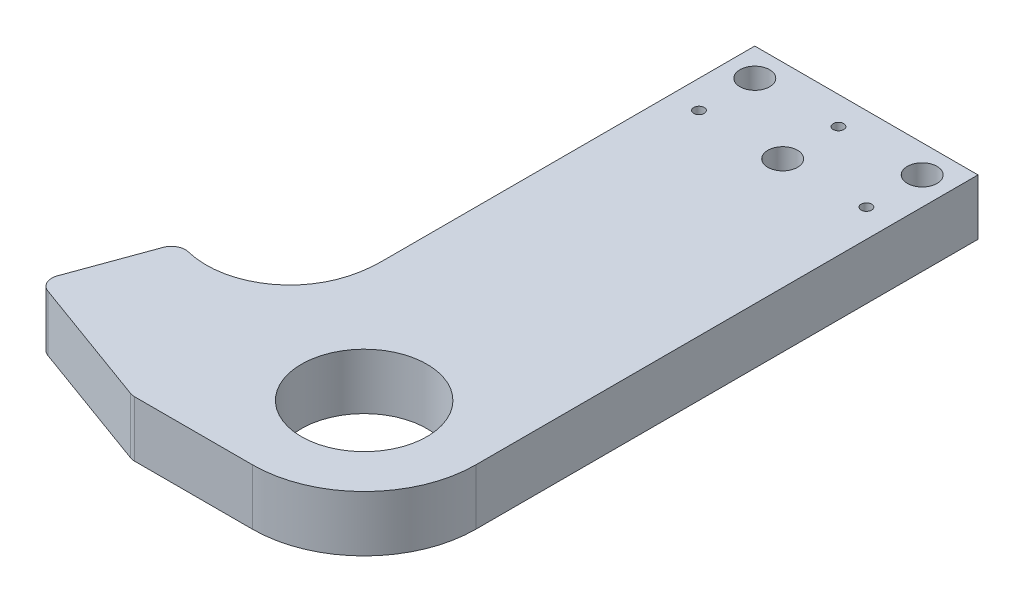
ISO-10303-21;
HEADER;
FILE_DESCRIPTION(('STEP AP214'),'2;1');
FILE_NAME('part.step','',(''),(''),'','','');
FILE_SCHEMA(('AUTOMOTIVE_DESIGN { 1 0 10303 214 1 1 1 1 }'));
ENDSEC;
DATA;
#1=APPLICATION_CONTEXT('core data for automotive mechanical design processes');
#2=APPLICATION_PROTOCOL_DEFINITION('international standard','automotive_design',2000,#1);
#3=PRODUCT_CONTEXT('',#1,'mechanical');
#4=PRODUCT('Part','Part','',(#3));
#5=PRODUCT_RELATED_PRODUCT_CATEGORY('part','',(#4));
#6=PRODUCT_DEFINITION_FORMATION('','',#4);
#7=PRODUCT_DEFINITION_CONTEXT('part definition',#1,'design');
#8=PRODUCT_DEFINITION('design','',#6,#7);
#9=PRODUCT_DEFINITION_SHAPE('','',#8);
#10=(LENGTH_UNIT() NAMED_UNIT(*) SI_UNIT(.MILLI.,.METRE.));
#11=(NAMED_UNIT(*) PLANE_ANGLE_UNIT() SI_UNIT($,.RADIAN.));
#12=(NAMED_UNIT(*) SI_UNIT($,.STERADIAN.) SOLID_ANGLE_UNIT());
#13=UNCERTAINTY_MEASURE_WITH_UNIT(LENGTH_MEASURE(1.E-05),#10,'distance_accuracy_value','');
#14=(GEOMETRIC_REPRESENTATION_CONTEXT(3) GLOBAL_UNCERTAINTY_ASSIGNED_CONTEXT((#13)) GLOBAL_UNIT_ASSIGNED_CONTEXT((#10,
#11,#12)) REPRESENTATION_CONTEXT('',''));
#15=CARTESIAN_POINT('',(0.,0.,0.));
#16=DIRECTION('',(0.,0.,1.));
#17=DIRECTION('',(1.,0.,0.));
#18=AXIS2_PLACEMENT_3D('',#15,#16,#17);
#19=CARTESIAN_POINT('',(25.4,6.35,0.));
#20=DIRECTION('',(1.,0.,0.));
#21=DIRECTION('',(0.,0.,-1.));
#22=AXIS2_PLACEMENT_3D('',#19,#20,#21);
#23=PLANE('',#22);
#24=DIRECTION('',(0.,0.,1.));
#25=VECTOR('',#24,1.);
#26=CARTESIAN_POINT('',(25.4,6.35,0.));
#27=LINE('',#26,#25);
#28=CARTESIAN_POINT('',(25.3999999999998,6.35,-57.15));
#29=VERTEX_POINT('',#28);
#30=CARTESIAN_POINT('',(25.4,6.35,57.15));
#31=VERTEX_POINT('',#30);
#32=EDGE_CURVE('E245',#29,#31,#27,.T.);
#33=ORIENTED_EDGE('',*,*,#32,.T.);
#34=DIRECTION('',(0.,-1.,0.));
#35=VECTOR('',#34,1.);
#36=CARTESIAN_POINT('',(25.4,6.35,57.15));
#37=LINE('',#36,#35);
#38=CARTESIAN_POINT('',(25.4,-6.35,57.15));
#39=VERTEX_POINT('',#38);
#40=EDGE_CURVE('E274',#31,#39,#37,.T.);
#41=ORIENTED_EDGE('',*,*,#40,.T.);
#42=DIRECTION('',(0.,0.,1.));
#43=VECTOR('',#42,1.);
#44=CARTESIAN_POINT('',(25.4,-6.35,0.));
#45=LINE('',#44,#43);
#46=CARTESIAN_POINT('',(25.3999999999998,-6.35,-57.15));
#47=VERTEX_POINT('',#46);
#48=EDGE_CURVE('E258',#47,#39,#45,.T.);
#49=ORIENTED_EDGE('',*,*,#48,.F.);
#50=DIRECTION('',(0.,-1.,0.));
#51=VECTOR('',#50,1.);
#52=CARTESIAN_POINT('',(25.3999999999998,6.35,-57.15));
#53=LINE('',#52,#51);
#54=EDGE_CURVE('E271',#29,#47,#53,.T.);
#55=ORIENTED_EDGE('',*,*,#54,.F.);
#56=EDGE_LOOP('',(#33,#41,#49,#55));
#57=FACE_BOUND('',#56,.T.);
#58=ADVANCED_FACE('F45',(#57),#23,.T.);
#59=CARTESIAN_POINT('',(0.,6.35,-57.15));
#60=DIRECTION('',(0.,0.,-1.));
#61=DIRECTION('',(-1.,0.,0.));
#62=AXIS2_PLACEMENT_3D('',#59,#60,#61);
#63=PLANE('',#62);
#64=DIRECTION('',(1.,0.,0.));
#65=VECTOR('',#64,1.);
#66=CARTESIAN_POINT('',(0.,-6.35,-57.15));
#67=LINE('',#66,#65);
#68=CARTESIAN_POINT('',(-25.4000000000002,-6.35,-57.15));
#69=VERTEX_POINT('',#68);
#70=EDGE_CURVE('E262',#69,#47,#67,.T.);
#71=ORIENTED_EDGE('',*,*,#70,.F.);
#72=DIRECTION('',(0.,-1.,0.));
#73=VECTOR('',#72,1.);
#74=CARTESIAN_POINT('',(-25.4000000000002,6.35,-57.15));
#75=LINE('',#74,#73);
#76=CARTESIAN_POINT('',(-25.4000000000002,6.35,-57.15));
#77=VERTEX_POINT('',#76);
#78=EDGE_CURVE('E257',#77,#69,#75,.T.);
#79=ORIENTED_EDGE('',*,*,#78,.F.);
#80=DIRECTION('',(1.,0.,0.));
#81=VECTOR('',#80,1.);
#82=CARTESIAN_POINT('',(0.,6.35,-57.15));
#83=LINE('',#82,#81);
#84=EDGE_CURVE('E249',#77,#29,#83,.T.);
#85=ORIENTED_EDGE('',*,*,#84,.T.);
#86=ORIENTED_EDGE('',*,*,#54,.T.);
#87=EDGE_LOOP('',(#71,#79,#85,#86));
#88=FACE_BOUND('',#87,.T.);
#89=ADVANCED_FACE('F371',(#88),#63,.T.);
#90=CARTESIAN_POINT('',(-25.4,6.35,0.));
#91=DIRECTION('',(-1.,0.,0.));
#92=DIRECTION('',(0.,0.,1.));
#93=AXIS2_PLACEMENT_3D('',#90,#91,#92);
#94=PLANE('',#93);
#95=DIRECTION('',(0.,0.,-1.));
#96=VECTOR('',#95,1.);
#97=CARTESIAN_POINT('',(-25.4,-6.35,0.));
#98=LINE('',#97,#96);
#99=CARTESIAN_POINT('',(-25.3999999999999,-6.35,27.8223380070355));
#100=VERTEX_POINT('',#99);
#101=EDGE_CURVE('E250',#100,#69,#98,.T.);
#102=ORIENTED_EDGE('',*,*,#101,.F.);
#103=DIRECTION('',(0.,-1.,0.));
#104=VECTOR('',#103,1.);
#105=CARTESIAN_POINT('',(-25.3999999999999,6.35,27.8223380070355));
#106=LINE('',#105,#104);
#107=CARTESIAN_POINT('',(-25.3999999999999,6.35,27.8223380070355));
#108=VERTEX_POINT('',#107);
#109=EDGE_CURVE('E284',#100,#108,#106,.F.);
#110=ORIENTED_EDGE('',*,*,#109,.T.);
#111=DIRECTION('',(0.,0.,-1.));
#112=VECTOR('',#111,1.);
#113=CARTESIAN_POINT('',(-25.4,6.35,0.));
#114=LINE('',#113,#112);
#115=EDGE_CURVE('E254',#108,#77,#114,.T.);
#116=ORIENTED_EDGE('',*,*,#115,.T.);
#117=ORIENTED_EDGE('',*,*,#78,.T.);
#118=EDGE_LOOP('',(#102,#110,#116,#117));
#119=FACE_BOUND('',#118,.T.);
#120=ADVANCED_FACE('F388',(#119),#94,.T.);
#121=CARTESIAN_POINT('',(0.,6.35,0.));
#122=DIRECTION('',(0.,1.,0.));
#123=DIRECTION('',(0.,0.,1.));
#124=AXIS2_PLACEMENT_3D('',#121,#122,#123);
#125=PLANE('',#124);
#126=CARTESIAN_POINT('',(19.0500000000001,6.35,-38.1));
#127=DIRECTION('',(0.,1.,0.));
#128=DIRECTION('',(0.,0.,1.));
#129=AXIS2_PLACEMENT_3D('',#126,#127,#128);
#130=CIRCLE('',#129,1.19062499999999);
#131=CARTESIAN_POINT('',(19.0500000000001,6.35,-36.909375));
#132=VERTEX_POINT('',#131);
#133=EDGE_CURVE('E159',#132,#132,#130,.T.);
#134=ORIENTED_EDGE('',*,*,#133,.F.);
#135=EDGE_LOOP('',(#134));
#136=FACE_BOUND('',#135,.T.);
#137=CARTESIAN_POINT('',(-19.0500000000001,6.35,-38.1));
#138=DIRECTION('',(0.,1.,0.));
#139=DIRECTION('',(0.,0.,1.));
#140=AXIS2_PLACEMENT_3D('',#137,#138,#139);
#141=CIRCLE('',#140,1.19062499999999);
#142=CARTESIAN_POINT('',(-19.0500000000001,6.35,-36.909375));
#143=VERTEX_POINT('',#142);
#144=EDGE_CURVE('E158',#143,#143,#141,.T.);
#145=ORIENTED_EDGE('',*,*,#144,.F.);
#146=EDGE_LOOP('',(#145));
#147=FACE_BOUND('',#146,.T.);
#148=CARTESIAN_POINT('',(-1.07552855510562E-13,6.35,-50.8));
#149=DIRECTION('',(0.,1.,0.));
#150=DIRECTION('',(0.,0.,1.));
#151=AXIS2_PLACEMENT_3D('',#148,#149,#150);
#152=CIRCLE('',#151,1.19062499999999);
#153=CARTESIAN_POINT('',(-1.07552855510562E-13,6.35,-49.609375));
#154=VERTEX_POINT('',#153);
#155=EDGE_CURVE('E173',#154,#154,#152,.T.);
#156=ORIENTED_EDGE('',*,*,#155,.F.);
#157=EDGE_LOOP('',(#156));
#158=FACE_BOUND('',#157,.T.);
#159=DIRECTION('',(0.939692620785909,0.,0.342020143325666));
#160=VECTOR('',#159,1.);
#161=CARTESIAN_POINT('',(-60.5515632410018,6.35,70.4919160399159));
#162=LINE('',#161,#160);
#163=CARTESIAN_POINT('',(-57.5680391700065,6.35,71.5778299949749));
#164=VERTEX_POINT('',#163);
#165=CARTESIAN_POINT('',(-27.9483256300921,6.35,82.3585240709952));
#166=VERTEX_POINT('',#165);
#167=EDGE_CURVE('E204',#164,#166,#162,.T.);
#168=ORIENTED_EDGE('',*,*,#167,.T.);
#169=CARTESIAN_POINT('',(-26.8624116750331,6.35,79.375));
#170=DIRECTION('',(0.,1.,0.));
#171=DIRECTION('',(0.,0.,1.));
#172=AXIS2_PLACEMENT_3D('',#169,#170,#171);
#173=CIRCLE('',#172,3.175);
#174=CARTESIAN_POINT('',(-26.8624116750331,6.35,82.55));
#175=VERTEX_POINT('',#174);
#176=EDGE_CURVE('E329',#166,#175,#173,.T.);
#177=ORIENTED_EDGE('',*,*,#176,.T.);
#178=DIRECTION('',(-1.,0.,0.));
#179=VECTOR('',#178,1.);
#180=CARTESIAN_POINT('',(-27.4222498387822,6.35,82.55));
#181=LINE('',#180,#179);
#182=CARTESIAN_POINT('',(0.,6.35,82.55));
#183=VERTEX_POINT('',#182);
#184=EDGE_CURVE('E185',#183,#175,#181,.T.);
#185=ORIENTED_EDGE('',*,*,#184,.F.);
#186=CARTESIAN_POINT('',(0.,6.35,57.15));
#187=DIRECTION('',(0.,1.,0.));
#188=DIRECTION('',(0.,0.,1.));
#189=AXIS2_PLACEMENT_3D('',#186,#187,#188);
#190=CIRCLE('',#189,25.4);
#191=EDGE_CURVE('E281',#183,#31,#190,.T.);
#192=ORIENTED_EDGE('',*,*,#191,.T.);
#193=ORIENTED_EDGE('',*,*,#32,.F.);
#194=ORIENTED_EDGE('',*,*,#84,.F.);
#195=ORIENTED_EDGE('',*,*,#115,.F.);
#196=CARTESIAN_POINT('',(-50.3999999999999,6.35,27.8223380070356));
#197=DIRECTION('',(0.,1.,0.));
#198=DIRECTION('',(0.,0.,1.));
#199=AXIS2_PLACEMENT_3D('',#196,#197,#198);
#200=CIRCLE('',#199,25.);
#201=CARTESIAN_POINT('',(-26.2925959594584,6.35,34.4429928406666));
#202=VERTEX_POINT('',#201);
#203=EDGE_CURVE('E293',#108,#202,#200,.F.);
#204=ORIENTED_EDGE('',*,*,#203,.T.);
#205=CARTESIAN_POINT('',(-44.662437838351,6.35,29.3980538574398));
#206=DIRECTION('',(0.,1.,0.));
#207=DIRECTION('',(0.,0.,1.));
#208=AXIS2_PLACEMENT_3D('',#205,#206,#207);
#209=CIRCLE('',#208,19.05);
#210=CARTESIAN_POINT('',(-49.2912086541131,6.35,47.8771496344292));
#211=VERTEX_POINT('',#210);
#212=EDGE_CURVE('E303',#202,#211,#209,.F.);
#213=ORIENTED_EDGE('',*,*,#212,.T.);
#214=CARTESIAN_POINT('',(-50.0626704567401,6.35,50.9569989305941));
#215=DIRECTION('',(0.,1.,0.));
#216=DIRECTION('',(0.,0.,1.));
#217=AXIS2_PLACEMENT_3D('',#214,#215,#216);
#218=CIRCLE('',#217,3.175);
#219=CARTESIAN_POINT('',(-53.0461945277354,6.35,49.8710849755352));
#220=VERTEX_POINT('',#219);
#221=EDGE_CURVE('E61',#211,#220,#218,.T.);
#222=ORIENTED_EDGE('',*,*,#221,.T.);
#223=DIRECTION('',(0.342020143325666,0.,-0.939692620785909));
#224=VECTOR('',#223,1.);
#225=CARTESIAN_POINT('',(-60.5515632410018,6.35,70.4919160399159));
#226=LINE('',#225,#224);
#227=CARTESIAN_POINT('',(-59.4656492859428,6.35,67.5083919689206));
#228=VERTEX_POINT('',#227);
#229=EDGE_CURVE('E201',#228,#220,#226,.T.);
#230=ORIENTED_EDGE('',*,*,#229,.F.);
#231=CARTESIAN_POINT('',(-56.4821252149475,6.35,68.5943059239796));
#232=DIRECTION('',(0.,1.,0.));
#233=DIRECTION('',(0.,0.,1.));
#234=AXIS2_PLACEMENT_3D('',#231,#232,#233);
#235=CIRCLE('',#234,3.175);
#236=EDGE_CURVE('E69',#228,#164,#235,.T.);
#237=ORIENTED_EDGE('',*,*,#236,.T.);
#238=EDGE_LOOP('',(#168,#177,#185,#192,#193,#194,#195,#204,#213,#222,#230,#237));
#239=FACE_BOUND('',#238,.T.);
#240=CARTESIAN_POINT('',(-19.0500000000001,6.35,-50.8));
#241=DIRECTION('',(0.,1.,0.));
#242=DIRECTION('',(0.,0.,1.));
#243=AXIS2_PLACEMENT_3D('',#240,#241,#242);
#244=CIRCLE('',#243,3.3782);
#245=CARTESIAN_POINT('',(-19.0500000000001,6.35,-47.4218));
#246=VERTEX_POINT('',#245);
#247=EDGE_CURVE('E212',#246,#246,#244,.T.);
#248=ORIENTED_EDGE('',*,*,#247,.F.);
#249=EDGE_LOOP('',(#248));
#250=FACE_BOUND('',#249,.T.);
#251=CARTESIAN_POINT('',(19.0499999999999,6.35,-50.8));
#252=DIRECTION('',(0.,1.,0.));
#253=DIRECTION('',(0.,0.,1.));
#254=AXIS2_PLACEMENT_3D('',#251,#252,#253);
#255=CIRCLE('',#254,3.3782);
#256=CARTESIAN_POINT('',(19.0499999999999,6.35,-47.4218));
#257=VERTEX_POINT('',#256);
#258=EDGE_CURVE('E220',#257,#257,#255,.T.);
#259=ORIENTED_EDGE('',*,*,#258,.F.);
#260=EDGE_LOOP('',(#259));
#261=FACE_BOUND('',#260,.T.);
#262=CARTESIAN_POINT('',(0.,6.35,-38.1));
#263=DIRECTION('',(0.,1.,0.));
#264=DIRECTION('',(0.,0.,1.));
#265=AXIS2_PLACEMENT_3D('',#262,#263,#264);
#266=CIRCLE('',#265,3.3782);
#267=CARTESIAN_POINT('',(0.,6.35,-34.7218));
#268=VERTEX_POINT('',#267);
#269=EDGE_CURVE('E228',#268,#268,#266,.T.);
#270=ORIENTED_EDGE('',*,*,#269,.F.);
#271=EDGE_LOOP('',(#270));
#272=FACE_BOUND('',#271,.T.);
#273=CARTESIAN_POINT('',(0.,6.35,57.15));
#274=DIRECTION('',(0.,1.,0.));
#275=DIRECTION('',(0.,0.,1.));
#276=AXIS2_PLACEMENT_3D('',#273,#274,#275);
#277=CIRCLE('',#276,14.2875);
#278=CARTESIAN_POINT('',(0.,6.35,71.4375));
#279=VERTEX_POINT('',#278);
#280=EDGE_CURVE('E236',#279,#279,#277,.T.);
#281=ORIENTED_EDGE('',*,*,#280,.F.);
#282=EDGE_LOOP('',(#281));
#283=FACE_BOUND('',#282,.T.);
#284=ADVANCED_FACE('F342',(#136,#147,#158,#239,#250,#261,#272,#283),#125,.T.);
#285=CARTESIAN_POINT('',(0.,-6.35,0.));
#286=DIRECTION('',(0.,1.,0.));
#287=DIRECTION('',(0.,0.,1.));
#288=AXIS2_PLACEMENT_3D('',#285,#286,#287);
#289=PLANE('',#288);
#290=DIRECTION('',(-1.,0.,0.));
#291=VECTOR('',#290,1.);
#292=CARTESIAN_POINT('',(-27.4222498387822,-6.35,82.55));
#293=LINE('',#292,#291);
#294=CARTESIAN_POINT('',(0.,-6.35,82.55));
#295=VERTEX_POINT('',#294);
#296=CARTESIAN_POINT('',(-26.8624116750331,-6.35,82.55));
#297=VERTEX_POINT('',#296);
#298=EDGE_CURVE('E181',#295,#297,#293,.T.);
#299=ORIENTED_EDGE('',*,*,#298,.T.);
#300=CARTESIAN_POINT('',(-26.8624116750331,-6.35,79.375));
#301=DIRECTION('',(0.,1.,0.));
#302=DIRECTION('',(0.,0.,1.));
#303=AXIS2_PLACEMENT_3D('',#300,#301,#302);
#304=CIRCLE('',#303,3.175);
#305=CARTESIAN_POINT('',(-27.9483256300921,-6.35,82.3585240709952));
#306=VERTEX_POINT('',#305);
#307=EDGE_CURVE('E316',#297,#306,#304,.F.);
#308=ORIENTED_EDGE('',*,*,#307,.T.);
#309=DIRECTION('',(0.939692620785909,0.,0.342020143325666));
#310=VECTOR('',#309,1.);
#311=CARTESIAN_POINT('',(-60.5515632410018,-6.35,70.4919160399159));
#312=LINE('',#311,#310);
#313=CARTESIAN_POINT('',(-57.5680391700065,-6.35,71.5778299949749));
#314=VERTEX_POINT('',#313);
#315=EDGE_CURVE('E208',#314,#306,#312,.T.);
#316=ORIENTED_EDGE('',*,*,#315,.F.);
#317=CARTESIAN_POINT('',(-56.4821252149475,-6.35,68.5943059239796));
#318=DIRECTION('',(0.,1.,0.));
#319=DIRECTION('',(0.,0.,1.));
#320=AXIS2_PLACEMENT_3D('',#317,#318,#319);
#321=CIRCLE('',#320,3.175);
#322=CARTESIAN_POINT('',(-59.4656492859428,-6.35,67.5083919689206));
#323=VERTEX_POINT('',#322);
#324=EDGE_CURVE('E313',#314,#323,#321,.F.);
#325=ORIENTED_EDGE('',*,*,#324,.T.);
#326=DIRECTION('',(-0.342020143325666,0.,0.939692620785909));
#327=VECTOR('',#326,1.);
#328=CARTESIAN_POINT('',(-52.0010596578601,-6.35,46.9996005202681));
#329=LINE('',#328,#327);
#330=CARTESIAN_POINT('',(-53.0461945277354,-6.35,49.8710849755351));
#331=VERTEX_POINT('',#330);
#332=EDGE_CURVE('E197',#331,#323,#329,.T.);
#333=ORIENTED_EDGE('',*,*,#332,.F.);
#334=CARTESIAN_POINT('',(-50.0626704567401,-6.34999999999999,50.9569989305941));
#335=DIRECTION('',(0.,1.,0.));
#336=DIRECTION('',(0.,0.,1.));
#337=AXIS2_PLACEMENT_3D('',#334,#335,#336);
#338=CIRCLE('',#337,3.175);
#339=CARTESIAN_POINT('',(-49.2912086541131,-6.34999999999999,47.8771496344292));
#340=VERTEX_POINT('',#339);
#341=EDGE_CURVE('E310',#331,#340,#338,.F.);
#342=ORIENTED_EDGE('',*,*,#341,.T.);
#343=CARTESIAN_POINT('',(-44.662437838351,-6.34999999999999,29.3980538574398));
#344=DIRECTION('',(0.,1.,0.));
#345=DIRECTION('',(0.,0.,1.));
#346=AXIS2_PLACEMENT_3D('',#343,#344,#345);
#347=CIRCLE('',#346,19.05);
#348=CARTESIAN_POINT('',(-26.2925959594584,-6.34999999999999,34.4429928406666));
#349=VERTEX_POINT('',#348);
#350=EDGE_CURVE('E300',#340,#349,#347,.T.);
#351=ORIENTED_EDGE('',*,*,#350,.T.);
#352=CARTESIAN_POINT('',(-50.3999999999999,-6.34999999999999,27.8223380070356));
#353=DIRECTION('',(0.,1.,0.));
#354=DIRECTION('',(0.,0.,1.));
#355=AXIS2_PLACEMENT_3D('',#352,#353,#354);
#356=CIRCLE('',#355,25.);
#357=EDGE_CURVE('E290',#349,#100,#356,.T.);
#358=ORIENTED_EDGE('',*,*,#357,.T.);
#359=ORIENTED_EDGE('',*,*,#101,.T.);
#360=ORIENTED_EDGE('',*,*,#70,.T.);
#361=ORIENTED_EDGE('',*,*,#48,.T.);
#362=CARTESIAN_POINT('',(0.,-6.35,57.15));
#363=DIRECTION('',(0.,1.,0.));
#364=DIRECTION('',(0.,0.,1.));
#365=AXIS2_PLACEMENT_3D('',#362,#363,#364);
#366=CIRCLE('',#365,25.4);
#367=EDGE_CURVE('E278',#39,#295,#366,.F.);
#368=ORIENTED_EDGE('',*,*,#367,.T.);
#369=EDGE_LOOP('',(#299,#308,#316,#325,#333,#342,#351,#358,#359,#360,#361,#368));
#370=FACE_BOUND('',#369,.T.);
#371=CARTESIAN_POINT('',(-19.0500000000001,-6.35,-50.8));
#372=DIRECTION('',(0.,1.,0.));
#373=DIRECTION('',(0.,0.,1.));
#374=AXIS2_PLACEMENT_3D('',#371,#372,#373);
#375=CIRCLE('',#374,3.3782);
#376=CARTESIAN_POINT('',(-19.0500000000001,-6.35,-47.4218));
#377=VERTEX_POINT('',#376);
#378=EDGE_CURVE('E216',#377,#377,#375,.T.);
#379=ORIENTED_EDGE('',*,*,#378,.T.);
#380=EDGE_LOOP('',(#379));
#381=FACE_BOUND('',#380,.T.);
#382=CARTESIAN_POINT('',(19.0499999999999,-6.35,-50.8));
#383=DIRECTION('',(0.,1.,0.));
#384=DIRECTION('',(0.,0.,1.));
#385=AXIS2_PLACEMENT_3D('',#382,#383,#384);
#386=CIRCLE('',#385,3.3782);
#387=CARTESIAN_POINT('',(19.0499999999999,-6.35,-47.4218));
#388=VERTEX_POINT('',#387);
#389=EDGE_CURVE('E224',#388,#388,#386,.T.);
#390=ORIENTED_EDGE('',*,*,#389,.T.);
#391=EDGE_LOOP('',(#390));
#392=FACE_BOUND('',#391,.T.);
#393=CARTESIAN_POINT('',(0.,-6.35,-38.1));
#394=DIRECTION('',(0.,1.,0.));
#395=DIRECTION('',(0.,0.,1.));
#396=AXIS2_PLACEMENT_3D('',#393,#394,#395);
#397=CIRCLE('',#396,3.3782);
#398=CARTESIAN_POINT('',(0.,-6.35,-34.7218));
#399=VERTEX_POINT('',#398);
#400=EDGE_CURVE('E232',#399,#399,#397,.T.);
#401=ORIENTED_EDGE('',*,*,#400,.T.);
#402=EDGE_LOOP('',(#401));
#403=FACE_BOUND('',#402,.T.);
#404=CARTESIAN_POINT('',(0.,-6.35,57.15));
#405=DIRECTION('',(0.,1.,0.));
#406=DIRECTION('',(0.,0.,1.));
#407=AXIS2_PLACEMENT_3D('',#404,#405,#406);
#408=CIRCLE('',#407,14.2875);
#409=CARTESIAN_POINT('',(0.,-6.35,71.4375));
#410=VERTEX_POINT('',#409);
#411=EDGE_CURVE('E237',#410,#410,#408,.T.);
#412=ORIENTED_EDGE('',*,*,#411,.T.);
#413=EDGE_LOOP('',(#412));
#414=FACE_BOUND('',#413,.T.);
#415=ADVANCED_FACE('F352',(#370,#381,#392,#403,#414),#289,.F.);
#416=CARTESIAN_POINT('',(0.,6.35,57.15));
#417=DIRECTION('',(0.,-1.,0.));
#418=DIRECTION('',(0.,0.,-1.));
#419=AXIS2_PLACEMENT_3D('',#416,#417,#418);
#420=CYLINDRICAL_SURFACE('',#419,25.4);
#421=ORIENTED_EDGE('',*,*,#191,.F.);
#422=DIRECTION('',(0.,-1.,0.));
#423=VECTOR('',#422,1.);
#424=CARTESIAN_POINT('',(0.,6.35,82.55));
#425=LINE('',#424,#423);
#426=EDGE_CURVE('E241',#183,#295,#425,.T.);
#427=ORIENTED_EDGE('',*,*,#426,.T.);
#428=ORIENTED_EDGE('',*,*,#367,.F.);
#429=ORIENTED_EDGE('',*,*,#40,.F.);
#430=EDGE_LOOP('',(#421,#427,#428,#429));
#431=FACE_BOUND('',#430,.T.);
#432=ADVANCED_FACE('F363',(#431),#420,.T.);
#433=CARTESIAN_POINT('',(0.,-6.35,57.15));
#434=DIRECTION('',(0.,1.,0.));
#435=DIRECTION('',(0.,0.,1.));
#436=AXIS2_PLACEMENT_3D('',#433,#434,#435);
#437=CYLINDRICAL_SURFACE('',#436,14.2875);
#438=ORIENTED_EDGE('',*,*,#411,.F.);
#439=EDGE_LOOP('',(#438));
#440=FACE_BOUND('',#439,.T.);
#441=ORIENTED_EDGE('',*,*,#280,.T.);
#442=EDGE_LOOP('',(#441));
#443=FACE_BOUND('',#442,.T.);
#444=ADVANCED_FACE('F406',(#440,#443),#437,.F.);
#445=CARTESIAN_POINT('',(0.,6.35,-38.1));
#446=DIRECTION('',(0.,1.,0.));
#447=DIRECTION('',(0.,0.,1.));
#448=AXIS2_PLACEMENT_3D('',#445,#446,#447);
#449=CYLINDRICAL_SURFACE('',#448,3.3782);
#450=ORIENTED_EDGE('',*,*,#400,.F.);
#451=EDGE_LOOP('',(#450));
#452=FACE_BOUND('',#451,.T.);
#453=ORIENTED_EDGE('',*,*,#269,.T.);
#454=EDGE_LOOP('',(#453));
#455=FACE_BOUND('',#454,.T.);
#456=ADVANCED_FACE('F454',(#452,#455),#449,.F.);
#457=CARTESIAN_POINT('',(19.0499999999999,6.35,-50.8));
#458=DIRECTION('',(0.,1.,0.));
#459=DIRECTION('',(0.,0.,1.));
#460=AXIS2_PLACEMENT_3D('',#457,#458,#459);
#461=CYLINDRICAL_SURFACE('',#460,3.3782);
#462=ORIENTED_EDGE('',*,*,#389,.F.);
#463=EDGE_LOOP('',(#462));
#464=FACE_BOUND('',#463,.T.);
#465=ORIENTED_EDGE('',*,*,#258,.T.);
#466=EDGE_LOOP('',(#465));
#467=FACE_BOUND('',#466,.T.);
#468=ADVANCED_FACE('F450',(#464,#467),#461,.F.);
#469=CARTESIAN_POINT('',(-19.0500000000001,6.35,-50.8));
#470=DIRECTION('',(0.,1.,0.));
#471=DIRECTION('',(0.,0.,1.));
#472=AXIS2_PLACEMENT_3D('',#469,#470,#471);
#473=CYLINDRICAL_SURFACE('',#472,3.3782);
#474=ORIENTED_EDGE('',*,*,#378,.F.);
#475=EDGE_LOOP('',(#474));
#476=FACE_BOUND('',#475,.T.);
#477=ORIENTED_EDGE('',*,*,#247,.T.);
#478=EDGE_LOOP('',(#477));
#479=FACE_BOUND('',#478,.T.);
#480=ADVANCED_FACE('F409',(#476,#479),#473,.F.);
#481=CARTESIAN_POINT('',(-50.3999999999999,66.5555112600166,27.8223380070356));
#482=DIRECTION('',(0.,1.,0.));
#483=DIRECTION('',(0.,0.,1.));
#484=AXIS2_PLACEMENT_3D('',#481,#482,#483);
#485=CYLINDRICAL_SURFACE('',#484,25.);
#486=ORIENTED_EDGE('',*,*,#357,.F.);
#487=DIRECTION('',(0.,1.,0.));
#488=VECTOR('',#487,1.);
#489=CARTESIAN_POINT('',(-26.2925959594584,66.5555112600166,34.4429928406666));
#490=LINE('',#489,#488);
#491=EDGE_CURVE('E297',#349,#202,#490,.T.);
#492=ORIENTED_EDGE('',*,*,#491,.T.);
#493=ORIENTED_EDGE('',*,*,#203,.F.);
#494=ORIENTED_EDGE('',*,*,#109,.F.);
#495=EDGE_LOOP('',(#486,#492,#493,#494));
#496=FACE_BOUND('',#495,.T.);
#497=ADVANCED_FACE('F380',(#496),#485,.F.);
#498=CARTESIAN_POINT('',(-60.5515632410018,-6.35,70.4919160399159));
#499=DIRECTION('',(0.342020143325666,0.,-0.939692620785909));
#500=DIRECTION('',(-0.939692620785909,0.,-0.342020143325666));
#501=AXIS2_PLACEMENT_3D('',#498,#499,#500);
#502=PLANE('',#501);
#503=ORIENTED_EDGE('',*,*,#315,.T.);
#504=DIRECTION('',(0.,-1.,0.));
#505=VECTOR('',#504,1.);
#506=CARTESIAN_POINT('',(-27.9483256300921,6.35,82.3585240709952));
#507=LINE('',#506,#505);
#508=EDGE_CURVE('E322',#306,#166,#507,.F.);
#509=ORIENTED_EDGE('',*,*,#508,.T.);
#510=ORIENTED_EDGE('',*,*,#167,.F.);
#511=DIRECTION('',(0.,1.,0.));
#512=VECTOR('',#511,1.);
#513=CARTESIAN_POINT('',(-57.5680391700065,-6.35,71.5778299949749));
#514=LINE('',#513,#512);
#515=EDGE_CURVE('E319',#164,#314,#514,.F.);
#516=ORIENTED_EDGE('',*,*,#515,.T.);
#517=EDGE_LOOP('',(#503,#509,#510,#516));
#518=FACE_BOUND('',#517,.T.);
#519=ADVANCED_FACE('F347',(#518),#502,.F.);
#520=CARTESIAN_POINT('',(-30.8127107852086,0.,-11.214909562869));
#521=DIRECTION('',(-0.939692620785909,0.,-0.342020143325666));
#522=DIRECTION('',(-0.342020143325666,0.,0.939692620785909));
#523=AXIS2_PLACEMENT_3D('',#520,#521,#522);
#524=PLANE('',#523);
#525=CARTESIAN_POINT('',(-56.276311449431,0.,58.745758280092));
#526=DIRECTION('',(-0.939692620785909,0.,-0.342020143325666));
#527=DIRECTION('',(-0.342020143325666,0.,0.939692620785909));
#528=AXIS2_PLACEMENT_3D('',#525,#526,#527);
#529=CIRCLE('',#528,2.0193);
#530=CARTESIAN_POINT('',(-56.9669527248485,0.,60.6432795892449));
#531=VERTEX_POINT('',#530);
#532=EDGE_CURVE('E189',#531,#531,#529,.T.);
#533=ORIENTED_EDGE('',*,*,#532,.F.);
#534=EDGE_LOOP('',(#533));
#535=FACE_BOUND('',#534,.T.);
#536=ORIENTED_EDGE('',*,*,#332,.T.);
#537=DIRECTION('',(0.,1.,0.));
#538=VECTOR('',#537,1.);
#539=CARTESIAN_POINT('',(-59.4656492859428,6.35,67.5083919689206));
#540=LINE('',#539,#538);
#541=EDGE_CURVE('E54',#323,#228,#540,.T.);
#542=ORIENTED_EDGE('',*,*,#541,.T.);
#543=ORIENTED_EDGE('',*,*,#229,.T.);
#544=DIRECTION('',(0.,-1.,0.));
#545=VECTOR('',#544,1.);
#546=CARTESIAN_POINT('',(-53.0461945277354,-6.34999999999999,49.8710849755351));
#547=LINE('',#546,#545);
#548=EDGE_CURVE('E332',#220,#331,#547,.T.);
#549=ORIENTED_EDGE('',*,*,#548,.T.);
#550=EDGE_LOOP('',(#536,#542,#543,#549));
#551=FACE_BOUND('',#550,.T.);
#552=ADVANCED_FACE('F338',(#535,#551),#524,.T.);
#553=CARTESIAN_POINT('',(-32.4081188814689,0.,67.4330699205639));
#554=DIRECTION('',(-0.939692620785909,0.,-0.342020143325666));
#555=DIRECTION('',(-0.342020143325666,0.,0.939692620785909));
#556=AXIS2_PLACEMENT_3D('',#553,#554,#555);
#557=CONICAL_SURFACE('',#556,2.01929999999999,1.02974425867665);
#558=CARTESIAN_POINT('',(-31.2679730530332,0.,67.8480490648372));
#559=VERTEX_POINT('',#558);
#560=VERTEX_LOOP('',#559);
#561=FACE_BOUND('',#560,.T.);
#562=CARTESIAN_POINT('',(-32.4081188814689,0.,67.4330699205639));
#563=DIRECTION('',(-0.939692620785909,0.,-0.342020143325666));
#564=DIRECTION('',(-0.342020143325666,0.,0.939692620785909));
#565=AXIS2_PLACEMENT_3D('',#562,#563,#564);
#566=CIRCLE('',#565,2.01929999999999);
#567=CARTESIAN_POINT('',(-33.0987601568864,0.,69.3305912297169));
#568=VERTEX_POINT('',#567);
#569=EDGE_CURVE('E193',#568,#568,#566,.T.);
#570=ORIENTED_EDGE('',*,*,#569,.T.);
#571=EDGE_LOOP('',(#570));
#572=FACE_BOUND('',#571,.T.);
#573=ADVANCED_FACE('F438',(#561,#572),#557,.F.);
#574=CARTESIAN_POINT('',(-56.276311449431,0.,58.745758280092));
#575=DIRECTION('',(-0.939692620785909,0.,-0.342020143325666));
#576=DIRECTION('',(-0.342020143325666,0.,0.939692620785909));
#577=AXIS2_PLACEMENT_3D('',#574,#575,#576);
#578=CYLINDRICAL_SURFACE('',#577,2.0193);
#579=CARTESIAN_POINT('',(-33.0987601568864,0.,69.3305912297169));
#580=CARTESIAN_POINT('',(-33.3473871628027,0.,69.2400984001286));
#581=CARTESIAN_POINT('',(-33.5960141687189,0.,69.1496055705404));
#582=CARTESIAN_POINT('',(-34.0932681805515,0.,68.9686199113639));
#583=CARTESIAN_POINT('',(-34.3418951864678,0.,68.8781270817756));
#584=CARTESIAN_POINT('',(-34.8391491983003,0.,68.6971414225991));
#585=CARTESIAN_POINT('',(-35.0877762042166,0.,68.6066485930109));
#586=CARTESIAN_POINT('',(-35.5850302160491,0.,68.4256629338344));
#587=CARTESIAN_POINT('',(-35.8336572219654,0.,68.3351701042461));
#588=CARTESIAN_POINT('',(-36.3309112337979,0.,68.1541844450696));
#589=CARTESIAN_POINT('',(-36.5795382397142,0.,68.0636916154814));
#590=CARTESIAN_POINT('',(-37.0767922515467,0.,67.8827059563049));
#591=CARTESIAN_POINT('',(-37.325419257463,0.,67.7922131267166));
#592=CARTESIAN_POINT('',(-37.8226732692956,0.,67.6112274675401));
#593=CARTESIAN_POINT('',(-38.0713002752118,0.,67.5207346379519));
#594=CARTESIAN_POINT('',(-38.5685542870444,0.,67.3397489787754));
#595=CARTESIAN_POINT('',(-38.8171812929606,0.,67.2492561491871));
#596=CARTESIAN_POINT('',(-39.3144353047932,0.,67.0682704900106));
#597=CARTESIAN_POINT('',(-39.5630623107095,0.,66.9777776604224));
#598=CARTESIAN_POINT('',(-40.060316322542,0.,66.7967920012459));
#599=CARTESIAN_POINT('',(-40.3089433284583,0.,66.7062991716577));
#600=CARTESIAN_POINT('',(-40.8061973402908,0.,66.5253135124811));
#601=CARTESIAN_POINT('',(-41.0548243462071,0.,66.4348206828929));
#602=CARTESIAN_POINT('',(-41.5520783580396,0.,66.2538350237164));
#603=CARTESIAN_POINT('',(-41.8007053639559,0.,66.1633421941281));
#604=CARTESIAN_POINT('',(-42.2979593757885,0.,65.9823565349517));
#605=CARTESIAN_POINT('',(-42.5465863817047,0.,65.8918637053634));
#606=CARTESIAN_POINT('',(-43.0438403935373,0.,65.7108780461869));
#607=CARTESIAN_POINT('',(-43.2924673994535,0.,65.6203852165986));
#608=CARTESIAN_POINT('',(-43.7897214112861,0.,65.4393995574222));
#609=CARTESIAN_POINT('',(-44.0383484172024,0.,65.3489067278339));
#610=CARTESIAN_POINT('',(-44.5356024290349,0.,65.1679210686574));
#611=CARTESIAN_POINT('',(-44.7842294349512,0.,65.0774282390692));
#612=CARTESIAN_POINT('',(-45.2814834467837,0.,64.8964425798926));
#613=CARTESIAN_POINT('',(-45.5301104527,0.,64.8059497503044));
#614=CARTESIAN_POINT('',(-46.0273644645325,0.,64.6249640911279));
#615=CARTESIAN_POINT('',(-46.2759914704488,0.,64.5344712615397));
#616=CARTESIAN_POINT('',(-46.7732454822813,0.,64.3534856023632));
#617=CARTESIAN_POINT('',(-47.0218724881976,0.,64.2629927727749));
#618=CARTESIAN_POINT('',(-47.5191265000302,0.,64.0820071135984));
#619=CARTESIAN_POINT('',(-47.7677535059464,0.,63.9915142840102));
#620=CARTESIAN_POINT('',(-48.265007517779,0.,63.8105286248337));
#621=CARTESIAN_POINT('',(-48.5136345236952,0.,63.7200357952454));
#622=CARTESIAN_POINT('',(-49.0108885355278,0.,63.5390501360689));
#623=CARTESIAN_POINT('',(-49.2595155414441,0.,63.4485573064807));
#624=CARTESIAN_POINT('',(-49.7567695532766,0.,63.2675716473042));
#625=CARTESIAN_POINT('',(-50.0053965591929,0.,63.1770788177159));
#626=CARTESIAN_POINT('',(-50.5026505710254,0.,62.9960931585394));
#627=CARTESIAN_POINT('',(-50.7512775769417,0.,62.9056003289512));
#628=CARTESIAN_POINT('',(-51.2485315887742,0.,62.7246146697747));
#629=CARTESIAN_POINT('',(-51.4971585946905,0.,62.6341218401864));
#630=CARTESIAN_POINT('',(-51.9944126065231,0.,62.4531361810099));
#631=CARTESIAN_POINT('',(-52.2430396124393,0.,62.3626433514217));
#632=CARTESIAN_POINT('',(-52.7402936242719,0.,62.1816576922452));
#633=CARTESIAN_POINT('',(-52.9889206301881,0.,62.0911648626569));
#634=CARTESIAN_POINT('',(-53.4861746420207,0.,61.9101792034804));
#635=CARTESIAN_POINT('',(-53.734801647937,0.,61.8196863738922));
#636=CARTESIAN_POINT('',(-54.2320556597695,0.,61.6387007147157));
#637=CARTESIAN_POINT('',(-54.4806826656858,0.,61.5482078851274));
#638=CARTESIAN_POINT('',(-54.9779366775183,0.,61.3672222259509));
#639=CARTESIAN_POINT('',(-55.2265636834346,0.,61.2767293963627));
#640=CARTESIAN_POINT('',(-55.7238176952671,0.,61.0957437371862));
#641=CARTESIAN_POINT('',(-55.9724447011834,0.,61.0052509075979));
#642=CARTESIAN_POINT('',(-56.4696987130159,0.,60.8242652484214));
#643=CARTESIAN_POINT('',(-56.7183257189322,0.,60.7337724188332));
#644=CARTESIAN_POINT('',(-56.9669527248485,0.,60.6432795892449));
#645=B_SPLINE_CURVE_WITH_KNOTS('',3,(#579,#580,#581,#582,#583,#584,#585,#586,#587,#588,#589,
#590,#591,#592,#593,#594,#595,#596,#597,#598,#599,#600,#601,#602,#603,#604,#605,#606,#607,#608,
#609,#610,#611,#612,#613,#614,#615,#616,#617,#618,#619,#620,#621,#622,#623,#624,#625,#626,#627,
#628,#629,#630,#631,#632,#633,#634,#635,#636,#637,#638,#639,#640,#641,#642,#643,#644),
.UNSPECIFIED.,.F.,.F.,(4,2,2,2,2,2,2,2,2,2,2,2,2,2,2,2,2,2,2,2,2,2,2,2,2,2,2,2,2,2,2,2,4),(0.,
0.793749999999996,1.58749999999999,2.38125,3.175,3.96875,4.7625,5.55625,6.35,7.14375,
7.93749999999999,8.73125,9.525,10.31875,11.1125,11.90625,12.7,13.49375,14.2875,15.08125,15.875,
16.66875,17.4625,18.25625,19.05,19.84375,20.6375,21.43125,22.225,23.01875,23.8125,24.60625,
25.4),.UNSPECIFIED.);
#646=EDGE_CURVE('BSEAM412',#568,#531,#645,.T.);
#647=ORIENTED_EDGE('',*,*,#569,.F.);
#648=ORIENTED_EDGE('',*,*,#532,.T.);
#649=ORIENTED_EDGE('',*,*,#646,.T.);
#650=ORIENTED_EDGE('',*,*,#646,.F.);
#651=EDGE_LOOP('',(#647,#649,#648,#650));
#652=FACE_BOUND('',#651,.T.);
#653=ADVANCED_FACE('F412',(#652),#578,.F.);
#654=CARTESIAN_POINT('',(-44.662437838351,66.5555112600166,29.3980538574398));
#655=DIRECTION('',(0.,1.,0.));
#656=DIRECTION('',(0.,0.,1.));
#657=AXIS2_PLACEMENT_3D('',#654,#655,#656);
#658=CYLINDRICAL_SURFACE('',#657,19.05);
#659=ORIENTED_EDGE('',*,*,#350,.F.);
#660=DIRECTION('',(0.,1.,0.));
#661=VECTOR('',#660,1.);
#662=CARTESIAN_POINT('',(-49.2912086541131,66.5555112600166,47.8771496344292));
#663=LINE('',#662,#661);
#664=EDGE_CURVE('E11',#340,#211,#663,.T.);
#665=ORIENTED_EDGE('',*,*,#664,.T.);
#666=ORIENTED_EDGE('',*,*,#212,.F.);
#667=ORIENTED_EDGE('',*,*,#491,.F.);
#668=EDGE_LOOP('',(#659,#665,#666,#667));
#669=FACE_BOUND('',#668,.T.);
#670=ADVANCED_FACE('F384',(#669),#658,.F.);
#671=CARTESIAN_POINT('',(-27.4222498387822,56.2630648778886,82.55));
#672=DIRECTION('',(0.,0.,1.));
#673=DIRECTION('',(1.,0.,0.));
#674=AXIS2_PLACEMENT_3D('',#671,#672,#673);
#675=PLANE('',#674);
#676=ORIENTED_EDGE('',*,*,#184,.T.);
#677=DIRECTION('',(0.,-1.,0.));
#678=VECTOR('',#677,1.);
#679=CARTESIAN_POINT('',(-26.8624116750331,-6.35,82.55));
#680=LINE('',#679,#678);
#681=EDGE_CURVE('E306',#175,#297,#680,.T.);
#682=ORIENTED_EDGE('',*,*,#681,.T.);
#683=ORIENTED_EDGE('',*,*,#298,.F.);
#684=ORIENTED_EDGE('',*,*,#426,.F.);
#685=EDGE_LOOP('',(#676,#682,#683,#684));
#686=FACE_BOUND('',#685,.T.);
#687=ADVANCED_FACE('F360',(#686),#675,.T.);
#688=CARTESIAN_POINT('',(-26.8624116750331,56.2630648778886,79.375));
#689=DIRECTION('',(0.,1.,0.));
#690=DIRECTION('',(0.,0.,1.));
#691=AXIS2_PLACEMENT_3D('',#688,#689,#690);
#692=CYLINDRICAL_SURFACE('',#691,3.175);
#693=ORIENTED_EDGE('',*,*,#176,.F.);
#694=ORIENTED_EDGE('',*,*,#508,.F.);
#695=ORIENTED_EDGE('',*,*,#307,.F.);
#696=ORIENTED_EDGE('',*,*,#681,.F.);
#697=EDGE_LOOP('',(#693,#694,#695,#696));
#698=FACE_BOUND('',#697,.T.);
#699=ADVANCED_FACE('F355',(#698),#692,.T.);
#700=CARTESIAN_POINT('',(-56.4821252149475,0.,68.5943059239796));
#701=DIRECTION('',(0.,-1.,0.));
#702=DIRECTION('',(0.,0.,-1.));
#703=AXIS2_PLACEMENT_3D('',#700,#701,#702);
#704=CYLINDRICAL_SURFACE('',#703,3.175);
#705=ORIENTED_EDGE('',*,*,#324,.F.);
#706=ORIENTED_EDGE('',*,*,#515,.F.);
#707=ORIENTED_EDGE('',*,*,#236,.F.);
#708=ORIENTED_EDGE('',*,*,#541,.F.);
#709=EDGE_LOOP('',(#705,#706,#707,#708));
#710=FACE_BOUND('',#709,.T.);
#711=ADVANCED_FACE('F350',(#710),#704,.T.);
#712=CARTESIAN_POINT('',(-50.0626704567401,66.5555112600166,50.9569989305941));
#713=DIRECTION('',(0.,1.,0.));
#714=DIRECTION('',(0.,0.,1.));
#715=AXIS2_PLACEMENT_3D('',#712,#713,#714);
#716=CYLINDRICAL_SURFACE('',#715,3.175);
#717=ORIENTED_EDGE('',*,*,#221,.F.);
#718=ORIENTED_EDGE('',*,*,#664,.F.);
#719=ORIENTED_EDGE('',*,*,#341,.F.);
#720=ORIENTED_EDGE('',*,*,#548,.F.);
#721=EDGE_LOOP('',(#717,#718,#719,#720));
#722=FACE_BOUND('',#721,.T.);
#723=ADVANCED_FACE('F47',(#722),#716,.T.);
#724=CARTESIAN_POINT('',(-1.07552855510562E-13,-1.778,-50.8));
#725=DIRECTION('',(0.,1.,0.));
#726=DIRECTION('',(0.,0.,1.));
#727=AXIS2_PLACEMENT_3D('',#724,#725,#726);
#728=CONICAL_SURFACE('',#727,1.190625,1.02974425867665);
#729=CARTESIAN_POINT('',(-1.09718863731561E-13,-2.49339967452969,-50.8));
#730=VERTEX_POINT('',#729);
#731=VERTEX_LOOP('',#730);
#732=FACE_BOUND('',#731,.T.);
#733=CARTESIAN_POINT('',(-1.07552855510562E-13,-1.778,-50.8));
#734=DIRECTION('',(0.,1.,0.));
#735=DIRECTION('',(0.,0.,1.));
#736=AXIS2_PLACEMENT_3D('',#733,#734,#735);
#737=CIRCLE('',#736,1.190625);
#738=CARTESIAN_POINT('',(-1.07552855510562E-13,-1.778,-49.609375));
#739=VERTEX_POINT('',#738);
#740=EDGE_CURVE('E177',#739,#739,#737,.T.);
#741=ORIENTED_EDGE('',*,*,#740,.T.);
#742=EDGE_LOOP('',(#741));
#743=FACE_BOUND('',#742,.T.);
#744=ADVANCED_FACE('F418',(#732,#743),#728,.F.);
#745=CARTESIAN_POINT('',(-1.07552855510562E-13,6.35,-50.8));
#746=DIRECTION('',(0.,1.,0.));
#747=DIRECTION('',(0.,0.,1.));
#748=AXIS2_PLACEMENT_3D('',#745,#746,#747);
#749=CYLINDRICAL_SURFACE('',#748,1.19062499999999);
#750=ORIENTED_EDGE('',*,*,#740,.F.);
#751=EDGE_LOOP('',(#750));
#752=FACE_BOUND('',#751,.T.);
#753=ORIENTED_EDGE('',*,*,#155,.T.);
#754=EDGE_LOOP('',(#753));
#755=FACE_BOUND('',#754,.T.);
#756=ADVANCED_FACE('F422',(#752,#755),#749,.F.);
#757=CARTESIAN_POINT('',(-19.0500000000001,-1.778,-38.1));
#758=DIRECTION('',(0.,1.,0.));
#759=DIRECTION('',(0.,0.,1.));
#760=AXIS2_PLACEMENT_3D('',#757,#758,#759);
#761=CONICAL_SURFACE('',#760,1.190625,1.02974425867665);
#762=CARTESIAN_POINT('',(-19.0500000000001,-2.49339967452969,-38.1));
#763=VERTEX_POINT('',#762);
#764=VERTEX_LOOP('',#763);
#765=FACE_BOUND('',#764,.T.);
#766=CARTESIAN_POINT('',(-19.0500000000001,-1.778,-38.1));
#767=DIRECTION('',(0.,1.,0.));
#768=DIRECTION('',(0.,0.,1.));
#769=AXIS2_PLACEMENT_3D('',#766,#767,#768);
#770=CIRCLE('',#769,1.190625);
#771=CARTESIAN_POINT('',(-19.0500000000001,-1.778,-36.909375));
#772=VERTEX_POINT('',#771);
#773=EDGE_CURVE('E165',#772,#772,#770,.T.);
#774=ORIENTED_EDGE('',*,*,#773,.T.);
#775=EDGE_LOOP('',(#774));
#776=FACE_BOUND('',#775,.T.);
#777=ADVANCED_FACE('F428',(#765,#776),#761,.F.);
#778=CARTESIAN_POINT('',(-19.0500000000001,6.35,-38.1));
#779=DIRECTION('',(0.,1.,0.));
#780=DIRECTION('',(0.,0.,1.));
#781=AXIS2_PLACEMENT_3D('',#778,#779,#780);
#782=CYLINDRICAL_SURFACE('',#781,1.19062499999999);
#783=ORIENTED_EDGE('',*,*,#773,.F.);
#784=EDGE_LOOP('',(#783));
#785=FACE_BOUND('',#784,.T.);
#786=ORIENTED_EDGE('',*,*,#144,.T.);
#787=EDGE_LOOP('',(#786));
#788=FACE_BOUND('',#787,.T.);
#789=ADVANCED_FACE('F151',(#785,#788),#782,.F.);
#790=CARTESIAN_POINT('',(19.0500000000001,-1.778,-38.1));
#791=DIRECTION('',(0.,1.,0.));
#792=DIRECTION('',(0.,0.,1.));
#793=AXIS2_PLACEMENT_3D('',#790,#791,#792);
#794=CONICAL_SURFACE('',#793,1.190625,1.02974425867665);
#795=CARTESIAN_POINT('',(19.0500000000001,-2.49339967452969,-38.1));
#796=VERTEX_POINT('',#795);
#797=VERTEX_LOOP('',#796);
#798=FACE_BOUND('',#797,.T.);
#799=CARTESIAN_POINT('',(19.0500000000001,-1.778,-38.1));
#800=DIRECTION('',(0.,1.,0.));
#801=DIRECTION('',(0.,0.,1.));
#802=AXIS2_PLACEMENT_3D('',#799,#800,#801);
#803=CIRCLE('',#802,1.190625);
#804=CARTESIAN_POINT('',(19.0500000000001,-1.778,-36.909375));
#805=VERTEX_POINT('',#804);
#806=EDGE_CURVE('E155',#805,#805,#803,.T.);
#807=ORIENTED_EDGE('',*,*,#806,.T.);
#808=EDGE_LOOP('',(#807));
#809=FACE_BOUND('',#808,.T.);
#810=ADVANCED_FACE('F147',(#798,#809),#794,.F.);
#811=CARTESIAN_POINT('',(19.0500000000001,6.35,-38.1));
#812=DIRECTION('',(0.,1.,0.));
#813=DIRECTION('',(0.,0.,1.));
#814=AXIS2_PLACEMENT_3D('',#811,#812,#813);
#815=CYLINDRICAL_SURFACE('',#814,1.19062499999999);
#816=ORIENTED_EDGE('',*,*,#806,.F.);
#817=EDGE_LOOP('',(#816));
#818=FACE_BOUND('',#817,.T.);
#819=ORIENTED_EDGE('',*,*,#133,.T.);
#820=EDGE_LOOP('',(#819));
#821=FACE_BOUND('',#820,.T.);
#822=ADVANCED_FACE('F150',(#818,#821),#815,.F.);
#823=CLOSED_SHELL('',(#58,#89,#120,#284,#415,#432,#444,#456,#468,#480,#497,#519,#552,#573,#653,
#670,#687,#699,#711,#723,#744,#756,#777,#789,#810,#822));
#824=MANIFOLD_SOLID_BREP('B2',#823);
#825=ADVANCED_BREP_SHAPE_REPRESENTATION('',(#18,#824),#14);
#826=SHAPE_DEFINITION_REPRESENTATION(#9,#825);
ENDSEC;
END-ISO-10303-21;
